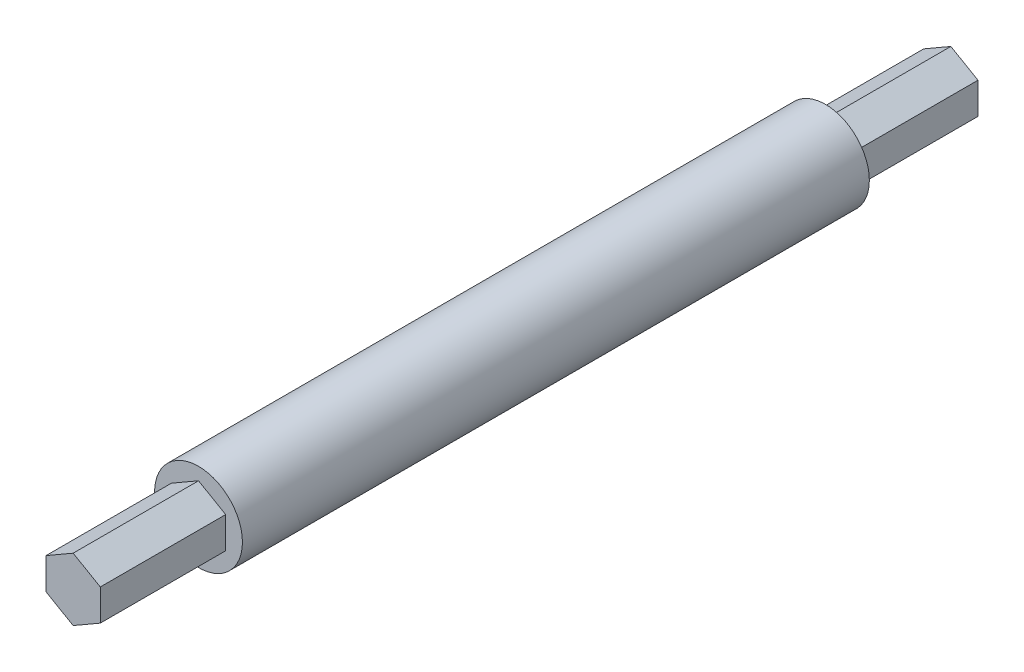
ISO-10303-21;
HEADER;
FILE_DESCRIPTION(('STEP AP214'),'2;1');
FILE_NAME('part.step','',(''),(''),'','','');
FILE_SCHEMA(('AUTOMOTIVE_DESIGN { 1 0 10303 214 1 1 1 1 }'));
ENDSEC;
DATA;
#1=APPLICATION_CONTEXT('core data for automotive mechanical design processes');
#2=APPLICATION_PROTOCOL_DEFINITION('international standard','automotive_design',2000,#1);
#3=PRODUCT_CONTEXT('',#1,'mechanical');
#4=PRODUCT('Part','Part','',(#3));
#5=PRODUCT_RELATED_PRODUCT_CATEGORY('part','',(#4));
#6=PRODUCT_DEFINITION_FORMATION('','',#4);
#7=PRODUCT_DEFINITION_CONTEXT('part definition',#1,'design');
#8=PRODUCT_DEFINITION('design','',#6,#7);
#9=PRODUCT_DEFINITION_SHAPE('','',#8);
#10=(LENGTH_UNIT() NAMED_UNIT(*) SI_UNIT(.MILLI.,.METRE.));
#11=(NAMED_UNIT(*) PLANE_ANGLE_UNIT() SI_UNIT($,.RADIAN.));
#12=(NAMED_UNIT(*) SI_UNIT($,.STERADIAN.) SOLID_ANGLE_UNIT());
#13=UNCERTAINTY_MEASURE_WITH_UNIT(LENGTH_MEASURE(1.E-05),#10,'distance_accuracy_value','');
#14=(GEOMETRIC_REPRESENTATION_CONTEXT(3) GLOBAL_UNCERTAINTY_ASSIGNED_CONTEXT((#13)) GLOBAL_UNIT_ASSIGNED_CONTEXT((#10,
#11,#12)) REPRESENTATION_CONTEXT('',''));
#15=CARTESIAN_POINT('',(0.,0.,0.));
#16=DIRECTION('',(0.,0.,1.));
#17=DIRECTION('',(1.,0.,0.));
#18=AXIS2_PLACEMENT_3D('',#15,#16,#17);
#19=CARTESIAN_POINT('',(0.,0.,-100.));
#20=DIRECTION('',(0.,0.,1.));
#21=DIRECTION('',(1.,0.,0.));
#22=AXIS2_PLACEMENT_3D('',#19,#20,#21);
#23=PLANE('',#22);
#24=CARTESIAN_POINT('',(0.,0.,-100.));
#25=DIRECTION('',(0.,0.,1.));
#26=DIRECTION('',(1.,0.,0.));
#27=AXIS2_PLACEMENT_3D('',#24,#25,#26);
#28=CIRCLE('',#27,7.);
#29=CARTESIAN_POINT('',(7.,0.,-100.));
#30=VERTEX_POINT('',#29);
#31=EDGE_CURVE('E11',#30,#30,#28,.T.);
#32=ORIENTED_EDGE('',*,*,#31,.F.);
#33=EDGE_LOOP('',(#32));
#34=FACE_BOUND('',#33,.T.);
#35=DIRECTION('',(0.866025403784436,0.500000000000004,0.));
#36=VECTOR('',#35,1.);
#37=CARTESIAN_POINT('',(-4.33012701892215,2.49999999999995,-100.));
#38=LINE('',#37,#36);
#39=CARTESIAN_POINT('',(-4.33012701892215,2.49999999999995,-100.));
#40=VERTEX_POINT('',#39);
#41=CARTESIAN_POINT('',(0.,4.99999999999994,-100.));
#42=VERTEX_POINT('',#41);
#43=EDGE_CURVE('E49',#40,#42,#38,.T.);
#44=ORIENTED_EDGE('',*,*,#43,.F.);
#45=DIRECTION('',(0.,1.,0.));
#46=VECTOR('',#45,1.);
#47=CARTESIAN_POINT('',(-4.33012701892222,-2.49999999999996,-100.));
#48=LINE('',#47,#46);
#49=CARTESIAN_POINT('',(-4.33012701892222,-2.49999999999996,-100.));
#50=VERTEX_POINT('',#49);
#51=EDGE_CURVE('E53',#50,#40,#48,.T.);
#52=ORIENTED_EDGE('',*,*,#51,.F.);
#53=DIRECTION('',(-0.866025403784435,0.500000000000007,0.));
#54=VECTOR('',#53,1.);
#55=CARTESIAN_POINT('',(0.,-5.,-100.));
#56=LINE('',#55,#54);
#57=CARTESIAN_POINT('',(0.,-5.,-100.));
#58=VERTEX_POINT('',#57);
#59=EDGE_CURVE('E366',#58,#50,#56,.T.);
#60=ORIENTED_EDGE('',*,*,#59,.F.);
#61=DIRECTION('',(-0.866025403784441,-0.499999999999995,0.));
#62=VECTOR('',#61,1.);
#63=CARTESIAN_POINT('',(4.33012701892218,-2.50000000000002,-100.));
#64=LINE('',#63,#62);
#65=CARTESIAN_POINT('',(4.33012701892218,-2.50000000000002,-100.));
#66=VERTEX_POINT('',#65);
#67=EDGE_CURVE('E381',#66,#58,#64,.T.);
#68=ORIENTED_EDGE('',*,*,#67,.F.);
#69=DIRECTION('',(0.,-1.,0.));
#70=VECTOR('',#69,1.);
#71=CARTESIAN_POINT('',(4.33012701892213,2.49999999999999,-100.));
#72=LINE('',#71,#70);
#73=CARTESIAN_POINT('',(4.33012701892213,2.49999999999999,-100.));
#74=VERTEX_POINT('',#73);
#75=EDGE_CURVE('E384',#74,#66,#72,.T.);
#76=ORIENTED_EDGE('',*,*,#75,.F.);
#77=DIRECTION('',(0.866025403784441,-0.499999999999996,0.));
#78=VECTOR('',#77,1.);
#79=CARTESIAN_POINT('',(0.,4.99999999999994,-100.));
#80=LINE('',#79,#78);
#81=EDGE_CURVE('E385',#42,#74,#80,.T.);
#82=ORIENTED_EDGE('',*,*,#81,.F.);
#83=EDGE_LOOP('',(#44,#52,#60,#68,#76,#82));
#84=FACE_BOUND('',#83,.T.);
#85=ADVANCED_FACE('F34',(#34,#84),#23,.F.);
#86=CARTESIAN_POINT('',(0.,0.,-100.));
#87=DIRECTION('',(0.,0.,1.));
#88=DIRECTION('',(1.,0.,0.));
#89=AXIS2_PLACEMENT_3D('',#86,#87,#88);
#90=CYLINDRICAL_SURFACE('',#89,7.);
#91=ORIENTED_EDGE('',*,*,#31,.T.);
#92=EDGE_LOOP('',(#91));
#93=FACE_BOUND('',#92,.T.);
#94=CARTESIAN_POINT('',(0.,0.,0.));
#95=DIRECTION('',(0.,0.,1.));
#96=DIRECTION('',(1.,0.,0.));
#97=AXIS2_PLACEMENT_3D('',#94,#95,#96);
#98=CIRCLE('',#97,7.);
#99=CARTESIAN_POINT('',(7.,0.,0.));
#100=VERTEX_POINT('',#99);
#101=EDGE_CURVE('E38',#100,#100,#98,.T.);
#102=ORIENTED_EDGE('',*,*,#101,.F.);
#103=EDGE_LOOP('',(#102));
#104=FACE_BOUND('',#103,.T.);
#105=ADVANCED_FACE('F36',(#93,#104),#90,.T.);
#106=CARTESIAN_POINT('',(0.,0.,0.));
#107=DIRECTION('',(0.,0.,1.));
#108=DIRECTION('',(1.,0.,0.));
#109=AXIS2_PLACEMENT_3D('',#106,#107,#108);
#110=PLANE('',#109);
#111=DIRECTION('',(-0.866025403784444,0.499999999999991,0.));
#112=VECTOR('',#111,1.);
#113=CARTESIAN_POINT('',(4.33012701892218,2.50000000000005,0.));
#114=LINE('',#113,#112);
#115=CARTESIAN_POINT('',(4.33012701892218,2.50000000000005,0.));
#116=VERTEX_POINT('',#115);
#117=CARTESIAN_POINT('',(0.,5.00000000000001,0.));
#118=VERTEX_POINT('',#117);
#119=EDGE_CURVE('E143',#116,#118,#114,.T.);
#120=ORIENTED_EDGE('',*,*,#119,.F.);
#121=DIRECTION('',(0.,1.,0.));
#122=VECTOR('',#121,1.);
#123=CARTESIAN_POINT('',(4.33012701892223,-2.49999999999996,0.));
#124=LINE('',#123,#122);
#125=CARTESIAN_POINT('',(4.33012701892223,-2.49999999999996,0.));
#126=VERTEX_POINT('',#125);
#127=EDGE_CURVE('E156',#126,#116,#124,.T.);
#128=ORIENTED_EDGE('',*,*,#127,.F.);
#129=DIRECTION('',(0.866025403784434,0.500000000000008,0.));
#130=VECTOR('',#129,1.);
#131=CARTESIAN_POINT('',(0.,-5.00000000000001,0.));
#132=LINE('',#131,#130);
#133=CARTESIAN_POINT('',(0.,-5.00000000000001,0.));
#134=VERTEX_POINT('',#133);
#135=EDGE_CURVE('E175',#134,#126,#132,.T.);
#136=ORIENTED_EDGE('',*,*,#135,.F.);
#137=DIRECTION('',(0.866025403784444,-0.499999999999991,0.));
#138=VECTOR('',#137,1.);
#139=CARTESIAN_POINT('',(-4.33012701892218,-2.50000000000005,0.));
#140=LINE('',#139,#138);
#141=CARTESIAN_POINT('',(-4.33012701892218,-2.50000000000005,0.));
#142=VERTEX_POINT('',#141);
#143=EDGE_CURVE('E172',#142,#134,#140,.T.);
#144=ORIENTED_EDGE('',*,*,#143,.F.);
#145=DIRECTION('',(0.,-1.,0.));
#146=VECTOR('',#145,1.);
#147=CARTESIAN_POINT('',(-4.33012701892223,2.49999999999996,0.));
#148=LINE('',#147,#146);
#149=CARTESIAN_POINT('',(-4.33012701892223,2.49999999999996,0.));
#150=VERTEX_POINT('',#149);
#151=EDGE_CURVE('E169',#150,#142,#148,.T.);
#152=ORIENTED_EDGE('',*,*,#151,.F.);
#153=DIRECTION('',(-0.866025403784434,-0.500000000000009,0.));
#154=VECTOR('',#153,1.);
#155=CARTESIAN_POINT('',(0.,5.00000000000001,0.));
#156=LINE('',#155,#154);
#157=EDGE_CURVE('E146',#118,#150,#156,.T.);
#158=ORIENTED_EDGE('',*,*,#157,.F.);
#159=EDGE_LOOP('',(#120,#128,#136,#144,#152,#158));
#160=FACE_BOUND('',#159,.T.);
#161=ORIENTED_EDGE('',*,*,#101,.T.);
#162=EDGE_LOOP('',(#161));
#163=FACE_BOUND('',#162,.T.);
#164=ADVANCED_FACE('F201',(#160,#163),#110,.T.);
#165=CARTESIAN_POINT('',(4.33012701892218,2.50000000000005,20.));
#166=DIRECTION('',(-0.499999999999991,-0.866025403784444,0.));
#167=DIRECTION('',(0.866025403784444,-0.499999999999991,0.));
#168=AXIS2_PLACEMENT_3D('',#165,#166,#167);
#169=PLANE('',#168);
#170=ORIENTED_EDGE('',*,*,#119,.T.);
#171=DIRECTION('',(0.,0.,-1.));
#172=VECTOR('',#171,1.);
#173=CARTESIAN_POINT('',(0.,5.00000000000001,20.));
#174=LINE('',#173,#172);
#175=CARTESIAN_POINT('',(0.,5.00000000000001,20.));
#176=VERTEX_POINT('',#175);
#177=EDGE_CURVE('E194',#176,#118,#174,.T.);
#178=ORIENTED_EDGE('',*,*,#177,.F.);
#179=DIRECTION('',(-0.866025403784444,0.499999999999991,0.));
#180=VECTOR('',#179,1.);
#181=CARTESIAN_POINT('',(4.33012701892218,2.50000000000005,20.));
#182=LINE('',#181,#180);
#183=CARTESIAN_POINT('',(4.33012701892218,2.50000000000005,20.));
#184=VERTEX_POINT('',#183);
#185=EDGE_CURVE('E152',#184,#176,#182,.T.);
#186=ORIENTED_EDGE('',*,*,#185,.F.);
#187=DIRECTION('',(0.,0.,-1.));
#188=VECTOR('',#187,1.);
#189=CARTESIAN_POINT('',(4.33012701892218,2.50000000000005,20.));
#190=LINE('',#189,#188);
#191=EDGE_CURVE('E165',#184,#116,#190,.T.);
#192=ORIENTED_EDGE('',*,*,#191,.T.);
#193=EDGE_LOOP('',(#170,#178,#186,#192));
#194=FACE_BOUND('',#193,.T.);
#195=ADVANCED_FACE('F209',(#194),#169,.F.);
#196=CARTESIAN_POINT('',(0.,5.00000000000001,20.));
#197=DIRECTION('',(0.500000000000009,-0.866025403784434,0.));
#198=DIRECTION('',(0.866025403784434,0.500000000000009,0.));
#199=AXIS2_PLACEMENT_3D('',#196,#197,#198);
#200=PLANE('',#199);
#201=ORIENTED_EDGE('',*,*,#157,.T.);
#202=DIRECTION('',(0.,0.,-1.));
#203=VECTOR('',#202,1.);
#204=CARTESIAN_POINT('',(-4.33012701892223,2.49999999999996,20.));
#205=LINE('',#204,#203);
#206=CARTESIAN_POINT('',(-4.33012701892223,2.49999999999996,20.));
#207=VERTEX_POINT('',#206);
#208=EDGE_CURVE('E191',#207,#150,#205,.T.);
#209=ORIENTED_EDGE('',*,*,#208,.F.);
#210=DIRECTION('',(-0.866025403784434,-0.500000000000009,0.));
#211=VECTOR('',#210,1.);
#212=CARTESIAN_POINT('',(0.,5.00000000000001,20.));
#213=LINE('',#212,#211);
#214=EDGE_CURVE('E155',#176,#207,#213,.T.);
#215=ORIENTED_EDGE('',*,*,#214,.F.);
#216=ORIENTED_EDGE('',*,*,#177,.T.);
#217=EDGE_LOOP('',(#201,#209,#215,#216));
#218=FACE_BOUND('',#217,.T.);
#219=ADVANCED_FACE('F219',(#218),#200,.F.);
#220=CARTESIAN_POINT('',(-4.33012701892223,2.49999999999996,20.));
#221=DIRECTION('',(1.,0.,0.));
#222=DIRECTION('',(0.,1.,0.));
#223=AXIS2_PLACEMENT_3D('',#220,#221,#222);
#224=PLANE('',#223);
#225=ORIENTED_EDGE('',*,*,#151,.T.);
#226=DIRECTION('',(0.,0.,-1.));
#227=VECTOR('',#226,1.);
#228=CARTESIAN_POINT('',(-4.33012701892218,-2.50000000000005,20.));
#229=LINE('',#228,#227);
#230=CARTESIAN_POINT('',(-4.33012701892218,-2.50000000000005,20.));
#231=VERTEX_POINT('',#230);
#232=EDGE_CURVE('E188',#231,#142,#229,.T.);
#233=ORIENTED_EDGE('',*,*,#232,.F.);
#234=DIRECTION('',(0.,-1.,0.));
#235=VECTOR('',#234,1.);
#236=CARTESIAN_POINT('',(-4.33012701892223,2.49999999999996,20.));
#237=LINE('',#236,#235);
#238=EDGE_CURVE('E158',#207,#231,#237,.T.);
#239=ORIENTED_EDGE('',*,*,#238,.F.);
#240=ORIENTED_EDGE('',*,*,#208,.T.);
#241=EDGE_LOOP('',(#225,#233,#239,#240));
#242=FACE_BOUND('',#241,.T.);
#243=ADVANCED_FACE('F223',(#242),#224,.F.);
#244=CARTESIAN_POINT('',(-4.33012701892218,-2.50000000000005,20.));
#245=DIRECTION('',(0.499999999999991,0.866025403784444,0.));
#246=DIRECTION('',(-0.866025403784444,0.499999999999991,0.));
#247=AXIS2_PLACEMENT_3D('',#244,#245,#246);
#248=PLANE('',#247);
#249=ORIENTED_EDGE('',*,*,#143,.T.);
#250=DIRECTION('',(0.,0.,-1.));
#251=VECTOR('',#250,1.);
#252=CARTESIAN_POINT('',(0.,-5.00000000000001,20.));
#253=LINE('',#252,#251);
#254=CARTESIAN_POINT('',(0.,-5.00000000000001,20.));
#255=VERTEX_POINT('',#254);
#256=EDGE_CURVE('E185',#255,#134,#253,.T.);
#257=ORIENTED_EDGE('',*,*,#256,.F.);
#258=DIRECTION('',(0.866025403784444,-0.499999999999991,0.));
#259=VECTOR('',#258,1.);
#260=CARTESIAN_POINT('',(-4.33012701892218,-2.50000000000005,20.));
#261=LINE('',#260,#259);
#262=EDGE_CURVE('E160',#231,#255,#261,.T.);
#263=ORIENTED_EDGE('',*,*,#262,.F.);
#264=ORIENTED_EDGE('',*,*,#232,.T.);
#265=EDGE_LOOP('',(#249,#257,#263,#264));
#266=FACE_BOUND('',#265,.T.);
#267=ADVANCED_FACE('F226',(#266),#248,.F.);
#268=CARTESIAN_POINT('',(0.,-5.00000000000001,20.));
#269=DIRECTION('',(-0.500000000000009,0.866025403784434,0.));
#270=DIRECTION('',(-0.866025403784434,-0.500000000000009,0.));
#271=AXIS2_PLACEMENT_3D('',#268,#269,#270);
#272=PLANE('',#271);
#273=ORIENTED_EDGE('',*,*,#135,.T.);
#274=DIRECTION('',(0.,0.,-1.));
#275=VECTOR('',#274,1.);
#276=CARTESIAN_POINT('',(4.33012701892223,-2.49999999999996,20.));
#277=LINE('',#276,#275);
#278=CARTESIAN_POINT('',(4.33012701892223,-2.49999999999996,20.));
#279=VERTEX_POINT('',#278);
#280=EDGE_CURVE('E182',#279,#126,#277,.T.);
#281=ORIENTED_EDGE('',*,*,#280,.F.);
#282=DIRECTION('',(0.866025403784434,0.500000000000008,0.));
#283=VECTOR('',#282,1.);
#284=CARTESIAN_POINT('',(0.,-5.00000000000001,20.));
#285=LINE('',#284,#283);
#286=EDGE_CURVE('E162',#255,#279,#285,.T.);
#287=ORIENTED_EDGE('',*,*,#286,.F.);
#288=ORIENTED_EDGE('',*,*,#256,.T.);
#289=EDGE_LOOP('',(#273,#281,#287,#288));
#290=FACE_BOUND('',#289,.T.);
#291=ADVANCED_FACE('F230',(#290),#272,.F.);
#292=CARTESIAN_POINT('',(4.33012701892223,-2.49999999999996,20.));
#293=DIRECTION('',(-1.,0.,0.));
#294=DIRECTION('',(0.,-1.,0.));
#295=AXIS2_PLACEMENT_3D('',#292,#293,#294);
#296=PLANE('',#295);
#297=ORIENTED_EDGE('',*,*,#127,.T.);
#298=ORIENTED_EDGE('',*,*,#191,.F.);
#299=DIRECTION('',(0.,1.,0.));
#300=VECTOR('',#299,1.);
#301=CARTESIAN_POINT('',(4.33012701892223,-2.49999999999996,20.));
#302=LINE('',#301,#300);
#303=EDGE_CURVE('E164',#279,#184,#302,.T.);
#304=ORIENTED_EDGE('',*,*,#303,.F.);
#305=ORIENTED_EDGE('',*,*,#280,.T.);
#306=EDGE_LOOP('',(#297,#298,#304,#305));
#307=FACE_BOUND('',#306,.T.);
#308=ADVANCED_FACE('F234',(#307),#296,.F.);
#309=CARTESIAN_POINT('',(0.,0.,20.));
#310=DIRECTION('',(0.,0.,1.));
#311=DIRECTION('',(1.,0.,0.));
#312=AXIS2_PLACEMENT_3D('',#309,#310,#311);
#313=PLANE('',#312);
#314=ORIENTED_EDGE('',*,*,#185,.T.);
#315=ORIENTED_EDGE('',*,*,#214,.T.);
#316=ORIENTED_EDGE('',*,*,#238,.T.);
#317=ORIENTED_EDGE('',*,*,#262,.T.);
#318=ORIENTED_EDGE('',*,*,#286,.T.);
#319=ORIENTED_EDGE('',*,*,#303,.T.);
#320=EDGE_LOOP('',(#314,#315,#316,#317,#318,#319));
#321=FACE_BOUND('',#320,.T.);
#322=ADVANCED_FACE('F238',(#321),#313,.T.);
#323=CARTESIAN_POINT('',(-4.33012701892215,2.49999999999995,-120.));
#324=DIRECTION('',(0.500000000000004,-0.866025403784436,0.));
#325=DIRECTION('',(0.866025403784436,0.500000000000004,0.));
#326=AXIS2_PLACEMENT_3D('',#323,#324,#325);
#327=PLANE('',#326);
#328=ORIENTED_EDGE('',*,*,#43,.T.);
#329=DIRECTION('',(0.,0.,1.));
#330=VECTOR('',#329,1.);
#331=CARTESIAN_POINT('',(0.,4.99999999999994,-120.));
#332=LINE('',#331,#330);
#333=CARTESIAN_POINT('',(0.,4.99999999999994,-120.));
#334=VERTEX_POINT('',#333);
#335=EDGE_CURVE('E126',#334,#42,#332,.T.);
#336=ORIENTED_EDGE('',*,*,#335,.F.);
#337=DIRECTION('',(0.866025403784436,0.500000000000004,0.));
#338=VECTOR('',#337,1.);
#339=CARTESIAN_POINT('',(-4.33012701892215,2.49999999999995,-120.));
#340=LINE('',#339,#338);
#341=CARTESIAN_POINT('',(-4.33012701892215,2.49999999999995,-120.));
#342=VERTEX_POINT('',#341);
#343=EDGE_CURVE('E132',#342,#334,#340,.T.);
#344=ORIENTED_EDGE('',*,*,#343,.F.);
#345=DIRECTION('',(0.,0.,1.));
#346=VECTOR('',#345,1.);
#347=CARTESIAN_POINT('',(-4.33012701892215,2.49999999999995,-120.));
#348=LINE('',#347,#346);
#349=EDGE_CURVE('E363',#342,#40,#348,.T.);
#350=ORIENTED_EDGE('',*,*,#349,.T.);
#351=EDGE_LOOP('',(#328,#336,#344,#350));
#352=FACE_BOUND('',#351,.T.);
#353=ADVANCED_FACE('F142',(#352),#327,.F.);
#354=CARTESIAN_POINT('',(0.,4.99999999999994,-120.));
#355=DIRECTION('',(-0.499999999999996,-0.866025403784441,0.));
#356=DIRECTION('',(0.866025403784441,-0.499999999999996,0.));
#357=AXIS2_PLACEMENT_3D('',#354,#355,#356);
#358=PLANE('',#357);
#359=ORIENTED_EDGE('',*,*,#81,.T.);
#360=DIRECTION('',(0.,0.,1.));
#361=VECTOR('',#360,1.);
#362=CARTESIAN_POINT('',(4.33012701892213,2.49999999999999,-120.));
#363=LINE('',#362,#361);
#364=CARTESIAN_POINT('',(4.33012701892213,2.49999999999999,-120.));
#365=VERTEX_POINT('',#364);
#366=EDGE_CURVE('E128',#365,#74,#363,.T.);
#367=ORIENTED_EDGE('',*,*,#366,.F.);
#368=DIRECTION('',(0.866025403784441,-0.499999999999996,0.));
#369=VECTOR('',#368,1.);
#370=CARTESIAN_POINT('',(0.,4.99999999999994,-120.));
#371=LINE('',#370,#369);
#372=EDGE_CURVE('E121',#334,#365,#371,.T.);
#373=ORIENTED_EDGE('',*,*,#372,.F.);
#374=ORIENTED_EDGE('',*,*,#335,.T.);
#375=EDGE_LOOP('',(#359,#367,#373,#374));
#376=FACE_BOUND('',#375,.T.);
#377=ADVANCED_FACE('F124',(#376),#358,.F.);
#378=CARTESIAN_POINT('',(4.33012701892213,2.49999999999999,-120.));
#379=DIRECTION('',(-1.,0.,0.));
#380=DIRECTION('',(0.,-1.,0.));
#381=AXIS2_PLACEMENT_3D('',#378,#379,#380);
#382=PLANE('',#381);
#383=ORIENTED_EDGE('',*,*,#75,.T.);
#384=DIRECTION('',(0.,0.,1.));
#385=VECTOR('',#384,1.);
#386=CARTESIAN_POINT('',(4.33012701892218,-2.50000000000002,-120.));
#387=LINE('',#386,#385);
#388=CARTESIAN_POINT('',(4.33012701892218,-2.50000000000002,-120.));
#389=VERTEX_POINT('',#388);
#390=EDGE_CURVE('E148',#389,#66,#387,.T.);
#391=ORIENTED_EDGE('',*,*,#390,.F.);
#392=DIRECTION('',(0.,-1.,0.));
#393=VECTOR('',#392,1.);
#394=CARTESIAN_POINT('',(4.33012701892213,2.49999999999999,-120.));
#395=LINE('',#394,#393);
#396=EDGE_CURVE('E131',#365,#389,#395,.T.);
#397=ORIENTED_EDGE('',*,*,#396,.F.);
#398=ORIENTED_EDGE('',*,*,#366,.T.);
#399=EDGE_LOOP('',(#383,#391,#397,#398));
#400=FACE_BOUND('',#399,.T.);
#401=ADVANCED_FACE('F247',(#400),#382,.F.);
#402=CARTESIAN_POINT('',(4.33012701892218,-2.50000000000002,-120.));
#403=DIRECTION('',(-0.499999999999995,0.866025403784442,0.));
#404=DIRECTION('',(-0.866025403784442,-0.499999999999995,0.));
#405=AXIS2_PLACEMENT_3D('',#402,#403,#404);
#406=PLANE('',#405);
#407=ORIENTED_EDGE('',*,*,#67,.T.);
#408=DIRECTION('',(0.,0.,1.));
#409=VECTOR('',#408,1.);
#410=CARTESIAN_POINT('',(0.,-5.,-120.));
#411=LINE('',#410,#409);
#412=CARTESIAN_POINT('',(0.,-5.,-120.));
#413=VERTEX_POINT('',#412);
#414=EDGE_CURVE('E369',#413,#58,#411,.T.);
#415=ORIENTED_EDGE('',*,*,#414,.F.);
#416=DIRECTION('',(-0.866025403784441,-0.499999999999995,0.));
#417=VECTOR('',#416,1.);
#418=CARTESIAN_POINT('',(4.33012701892218,-2.50000000000002,-120.));
#419=LINE('',#418,#417);
#420=EDGE_CURVE('E382',#389,#413,#419,.T.);
#421=ORIENTED_EDGE('',*,*,#420,.F.);
#422=ORIENTED_EDGE('',*,*,#390,.T.);
#423=EDGE_LOOP('',(#407,#415,#421,#422));
#424=FACE_BOUND('',#423,.T.);
#425=ADVANCED_FACE('F250',(#424),#406,.F.);
#426=CARTESIAN_POINT('',(0.,-5.,-120.));
#427=DIRECTION('',(0.500000000000007,0.866025403784435,0.));
#428=DIRECTION('',(-0.866025403784435,0.500000000000007,0.));
#429=AXIS2_PLACEMENT_3D('',#426,#427,#428);
#430=PLANE('',#429);
#431=ORIENTED_EDGE('',*,*,#59,.T.);
#432=DIRECTION('',(0.,0.,1.));
#433=VECTOR('',#432,1.);
#434=CARTESIAN_POINT('',(-4.33012701892222,-2.49999999999996,-120.));
#435=LINE('',#434,#433);
#436=CARTESIAN_POINT('',(-4.33012701892222,-2.49999999999996,-120.));
#437=VERTEX_POINT('',#436);
#438=EDGE_CURVE('E365',#437,#50,#435,.T.);
#439=ORIENTED_EDGE('',*,*,#438,.F.);
#440=DIRECTION('',(-0.866025403784435,0.500000000000007,0.));
#441=VECTOR('',#440,1.);
#442=CARTESIAN_POINT('',(0.,-5.,-120.));
#443=LINE('',#442,#441);
#444=EDGE_CURVE('E371',#413,#437,#443,.T.);
#445=ORIENTED_EDGE('',*,*,#444,.F.);
#446=ORIENTED_EDGE('',*,*,#414,.T.);
#447=EDGE_LOOP('',(#431,#439,#445,#446));
#448=FACE_BOUND('',#447,.T.);
#449=ADVANCED_FACE('F254',(#448),#430,.F.);
#450=CARTESIAN_POINT('',(-4.33012701892222,-2.49999999999996,-120.));
#451=DIRECTION('',(1.,0.,0.));
#452=DIRECTION('',(0.,1.,0.));
#453=AXIS2_PLACEMENT_3D('',#450,#451,#452);
#454=PLANE('',#453);
#455=ORIENTED_EDGE('',*,*,#51,.T.);
#456=ORIENTED_EDGE('',*,*,#349,.F.);
#457=DIRECTION('',(0.,1.,0.));
#458=VECTOR('',#457,1.);
#459=CARTESIAN_POINT('',(-4.33012701892222,-2.49999999999996,-120.));
#460=LINE('',#459,#458);
#461=EDGE_CURVE('E137',#437,#342,#460,.T.);
#462=ORIENTED_EDGE('',*,*,#461,.F.);
#463=ORIENTED_EDGE('',*,*,#438,.T.);
#464=EDGE_LOOP('',(#455,#456,#462,#463));
#465=FACE_BOUND('',#464,.T.);
#466=ADVANCED_FACE('F258',(#465),#454,.F.);
#467=CARTESIAN_POINT('',(0.,0.,-120.));
#468=DIRECTION('',(0.,0.,-1.));
#469=DIRECTION('',(-1.,0.,0.));
#470=AXIS2_PLACEMENT_3D('',#467,#468,#469);
#471=PLANE('',#470);
#472=ORIENTED_EDGE('',*,*,#343,.T.);
#473=ORIENTED_EDGE('',*,*,#372,.T.);
#474=ORIENTED_EDGE('',*,*,#396,.T.);
#475=ORIENTED_EDGE('',*,*,#420,.T.);
#476=ORIENTED_EDGE('',*,*,#444,.T.);
#477=ORIENTED_EDGE('',*,*,#461,.T.);
#478=EDGE_LOOP('',(#472,#473,#474,#475,#476,#477));
#479=FACE_BOUND('',#478,.T.);
#480=ADVANCED_FACE('F135',(#479),#471,.T.);
#481=CLOSED_SHELL('',(#85,#105,#164,#195,#219,#243,#267,#291,#308,#322,#353,#377,#401,#425,#449,
#466,#480));
#482=MANIFOLD_SOLID_BREP('B2',#481);
#483=ADVANCED_BREP_SHAPE_REPRESENTATION('',(#18,#482),#14);
#484=SHAPE_DEFINITION_REPRESENTATION(#9,#483);
ENDSEC;
END-ISO-10303-21;
